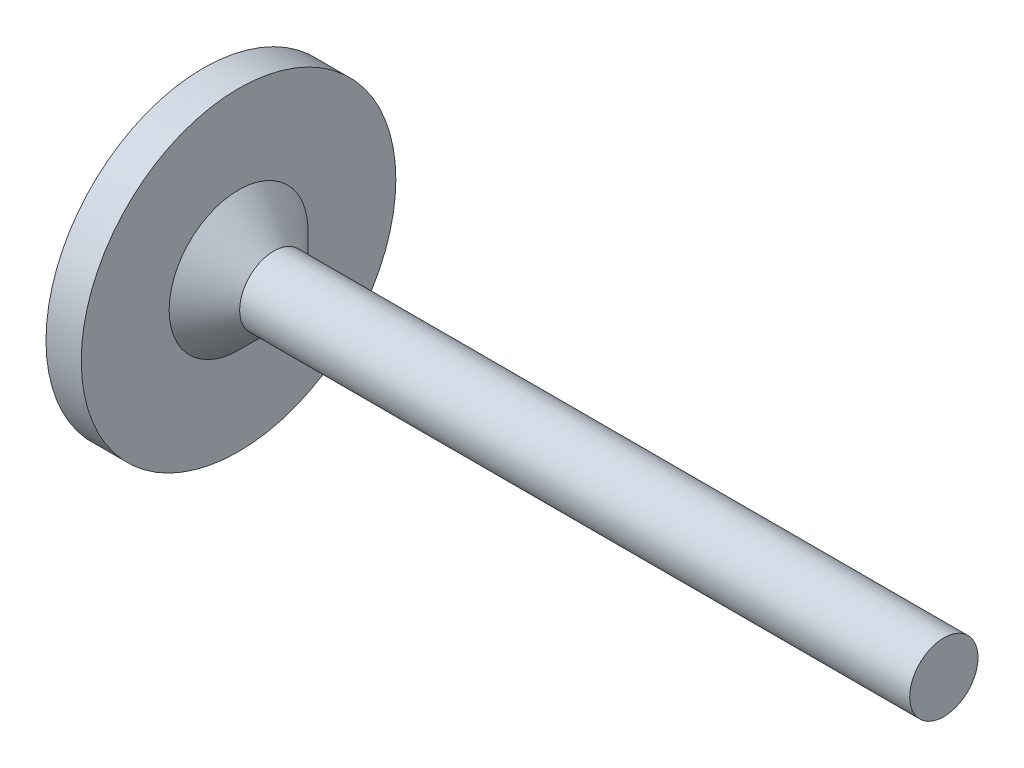
ISO-10303-21;
HEADER;
FILE_DESCRIPTION(('STEP AP214'),'2;1');
FILE_NAME('part.step','',(''),(''),'','','');
FILE_SCHEMA(('AUTOMOTIVE_DESIGN { 1 0 10303 214 1 1 1 1 }'));
ENDSEC;
DATA;
#1=APPLICATION_CONTEXT('core data for automotive mechanical design processes');
#2=APPLICATION_PROTOCOL_DEFINITION('international standard','automotive_design',2000,#1);
#3=PRODUCT_CONTEXT('',#1,'mechanical');
#4=PRODUCT('Part','Part','',(#3));
#5=PRODUCT_RELATED_PRODUCT_CATEGORY('part','',(#4));
#6=PRODUCT_DEFINITION_FORMATION('','',#4);
#7=PRODUCT_DEFINITION_CONTEXT('part definition',#1,'design');
#8=PRODUCT_DEFINITION('design','',#6,#7);
#9=PRODUCT_DEFINITION_SHAPE('','',#8);
#10=(LENGTH_UNIT() NAMED_UNIT(*) SI_UNIT(.MILLI.,.METRE.));
#11=(NAMED_UNIT(*) PLANE_ANGLE_UNIT() SI_UNIT($,.RADIAN.));
#12=(NAMED_UNIT(*) SI_UNIT($,.STERADIAN.) SOLID_ANGLE_UNIT());
#13=UNCERTAINTY_MEASURE_WITH_UNIT(LENGTH_MEASURE(1.E-05),#10,'distance_accuracy_value','');
#14=(GEOMETRIC_REPRESENTATION_CONTEXT(3) GLOBAL_UNCERTAINTY_ASSIGNED_CONTEXT((#13)) GLOBAL_UNIT_ASSIGNED_CONTEXT((#10,
#11,#12)) REPRESENTATION_CONTEXT('',''));
#15=CARTESIAN_POINT('',(0.,0.,0.));
#16=DIRECTION('',(0.,0.,1.));
#17=DIRECTION('',(1.,0.,0.));
#18=AXIS2_PLACEMENT_3D('',#15,#16,#17);
#19=CARTESIAN_POINT('',(127.,0.,0.));
#20=DIRECTION('',(-1.,0.,0.));
#21=DIRECTION('',(0.,0.,1.));
#22=AXIS2_PLACEMENT_3D('',#19,#20,#21);
#23=CYLINDRICAL_SURFACE('',#22,6.15);
#24=CARTESIAN_POINT('',(6.35000000000001,0.,0.));
#25=DIRECTION('',(-1.,0.,0.));
#26=DIRECTION('',(0.,0.,1.));
#27=AXIS2_PLACEMENT_3D('',#24,#25,#26);
#28=CIRCLE('',#27,6.15);
#29=CARTESIAN_POINT('',(6.35000000000001,0.,6.15));
#30=VERTEX_POINT('',#29);
#31=EDGE_CURVE('E45',#30,#30,#28,.F.);
#32=ORIENTED_EDGE('',*,*,#31,.T.);
#33=EDGE_LOOP('',(#32));
#34=FACE_BOUND('',#33,.T.);
#35=CARTESIAN_POINT('',(127.,0.,0.));
#36=DIRECTION('',(1.,0.,0.));
#37=DIRECTION('',(0.,0.,-1.));
#38=AXIS2_PLACEMENT_3D('',#35,#36,#37);
#39=CIRCLE('',#38,6.15);
#40=CARTESIAN_POINT('',(127.,0.,-6.15));
#41=VERTEX_POINT('',#40);
#42=EDGE_CURVE('E49',#41,#41,#39,.T.);
#43=ORIENTED_EDGE('',*,*,#42,.F.);
#44=EDGE_LOOP('',(#43));
#45=FACE_BOUND('',#44,.T.);
#46=ADVANCED_FACE('F37',(#34,#45),#23,.T.);
#47=CARTESIAN_POINT('',(127.,0.,0.));
#48=DIRECTION('',(1.,0.,0.));
#49=DIRECTION('',(0.,0.,-1.));
#50=AXIS2_PLACEMENT_3D('',#47,#48,#49);
#51=PLANE('',#50);
#52=ORIENTED_EDGE('',*,*,#42,.T.);
#53=EDGE_LOOP('',(#52));
#54=FACE_BOUND('',#53,.T.);
#55=ADVANCED_FACE('F67',(#54),#51,.T.);
#56=CARTESIAN_POINT('',(-6.35,0.,0.));
#57=DIRECTION('',(1.,0.,0.));
#58=DIRECTION('',(0.,0.,-1.));
#59=AXIS2_PLACEMENT_3D('',#56,#57,#58);
#60=CYLINDRICAL_SURFACE('',#59,28.321);
#61=CARTESIAN_POINT('',(-6.35,0.,0.));
#62=DIRECTION('',(-1.,0.,0.));
#63=DIRECTION('',(0.,0.,1.));
#64=AXIS2_PLACEMENT_3D('',#61,#62,#63);
#65=CIRCLE('',#64,28.321);
#66=CARTESIAN_POINT('',(-6.35,0.,28.321));
#67=VERTEX_POINT('',#66);
#68=EDGE_CURVE('E53',#67,#67,#65,.T.);
#69=ORIENTED_EDGE('',*,*,#68,.F.);
#70=EDGE_LOOP('',(#69));
#71=FACE_BOUND('',#70,.T.);
#72=CARTESIAN_POINT('',(0.,0.,0.));
#73=DIRECTION('',(-1.,0.,0.));
#74=DIRECTION('',(0.,0.,1.));
#75=AXIS2_PLACEMENT_3D('',#72,#73,#74);
#76=CIRCLE('',#75,28.321);
#77=CARTESIAN_POINT('',(0.,0.,28.321));
#78=VERTEX_POINT('',#77);
#79=EDGE_CURVE('E56',#78,#78,#76,.T.);
#80=ORIENTED_EDGE('',*,*,#79,.T.);
#81=EDGE_LOOP('',(#80));
#82=FACE_BOUND('',#81,.T.);
#83=ADVANCED_FACE('F64',(#71,#82),#60,.T.);
#84=CARTESIAN_POINT('',(-6.35,0.,0.));
#85=DIRECTION('',(-1.,0.,0.));
#86=DIRECTION('',(0.,0.,1.));
#87=AXIS2_PLACEMENT_3D('',#84,#85,#86);
#88=PLANE('',#87);
#89=ORIENTED_EDGE('',*,*,#68,.T.);
#90=EDGE_LOOP('',(#89));
#91=FACE_BOUND('',#90,.T.);
#92=ADVANCED_FACE('F62',(#91),#88,.T.);
#93=CARTESIAN_POINT('',(0.,0.,0.));
#94=DIRECTION('',(-1.,0.,0.));
#95=DIRECTION('',(0.,0.,1.));
#96=AXIS2_PLACEMENT_3D('',#93,#94,#95);
#97=PLANE('',#96);
#98=CARTESIAN_POINT('',(0.,0.,0.));
#99=DIRECTION('',(-1.,0.,0.));
#100=DIRECTION('',(0.,0.,1.));
#101=AXIS2_PLACEMENT_3D('',#98,#99,#100);
#102=CIRCLE('',#101,12.4999999999999);
#103=CARTESIAN_POINT('',(0.,0.,12.4999999999999));
#104=VERTEX_POINT('',#103);
#105=EDGE_CURVE('E10',#104,#104,#102,.T.);
#106=ORIENTED_EDGE('',*,*,#105,.T.);
#107=EDGE_LOOP('',(#106));
#108=FACE_BOUND('',#107,.T.);
#109=ORIENTED_EDGE('',*,*,#79,.F.);
#110=EDGE_LOOP('',(#109));
#111=FACE_BOUND('',#110,.T.);
#112=ADVANCED_FACE('F71',(#108,#111),#97,.F.);
#113=CARTESIAN_POINT('',(6.35000000000001,0.,0.));
#114=DIRECTION('',(-1.,0.,0.));
#115=DIRECTION('',(0.,0.,1.));
#116=AXIS2_PLACEMENT_3D('',#113,#114,#115);
#117=CONICAL_SURFACE('',#116,6.15,0.785398163397443);
#118=CARTESIAN_POINT('',(0.,0.,12.4999999999999));
#119=CARTESIAN_POINT('',(0.0661458333333346,0.,12.4338541666666));
#120=CARTESIAN_POINT('',(0.132291666666668,0.,12.3677083333333));
#121=CARTESIAN_POINT('',(0.264583333333335,0.,12.2354166666666));
#122=CARTESIAN_POINT('',(0.330729166666668,0.,12.1692708333333));
#123=CARTESIAN_POINT('',(0.463020833333335,0.,12.0369791666666));
#124=CARTESIAN_POINT('',(0.529166666666668,0.,11.9708333333333));
#125=CARTESIAN_POINT('',(0.661458333333335,0.,11.8385416666666));
#126=CARTESIAN_POINT('',(0.727604166666668,0.,11.7723958333333));
#127=CARTESIAN_POINT('',(0.859895833333335,0.,11.6401041666666));
#128=CARTESIAN_POINT('',(0.926041666666669,0.,11.5739583333333));
#129=CARTESIAN_POINT('',(1.05833333333334,0.,11.4416666666666));
#130=CARTESIAN_POINT('',(1.12447916666667,0.,11.3755208333333));
#131=CARTESIAN_POINT('',(1.25677083333334,0.,11.2432291666666));
#132=CARTESIAN_POINT('',(1.32291666666667,0.,11.1770833333333));
#133=CARTESIAN_POINT('',(1.45520833333334,0.,11.0447916666666));
#134=CARTESIAN_POINT('',(1.52135416666667,0.,10.9786458333333));
#135=CARTESIAN_POINT('',(1.65364583333334,0.,10.8463541666666));
#136=CARTESIAN_POINT('',(1.71979166666667,0.,10.7802083333333));
#137=CARTESIAN_POINT('',(1.85208333333334,0.,10.6479166666666));
#138=CARTESIAN_POINT('',(1.91822916666667,0.,10.5817708333333));
#139=CARTESIAN_POINT('',(2.05052083333334,0.,10.4494791666666));
#140=CARTESIAN_POINT('',(2.11666666666667,0.,10.3833333333333));
#141=CARTESIAN_POINT('',(2.24895833333334,0.,10.2510416666666));
#142=CARTESIAN_POINT('',(2.31510416666667,0.,10.1848958333333));
#143=CARTESIAN_POINT('',(2.44739583333334,0.,10.0526041666666));
#144=CARTESIAN_POINT('',(2.51354166666667,0.,9.9864583333333));
#145=CARTESIAN_POINT('',(2.64583333333334,0.,9.85416666666663));
#146=CARTESIAN_POINT('',(2.71197916666667,0.,9.7880208333333));
#147=CARTESIAN_POINT('',(2.84427083333334,0.,9.65572916666663));
#148=CARTESIAN_POINT('',(2.91041666666667,0.,9.5895833333333));
#149=CARTESIAN_POINT('',(3.04270833333334,0.,9.45729166666663));
#150=CARTESIAN_POINT('',(3.10885416666667,0.,9.3911458333333));
#151=CARTESIAN_POINT('',(3.24114583333334,0.,9.25885416666664));
#152=CARTESIAN_POINT('',(3.30729166666667,0.,9.1927083333333));
#153=CARTESIAN_POINT('',(3.43958333333334,0.,9.06041666666664));
#154=CARTESIAN_POINT('',(3.50572916666667,0.,8.9942708333333));
#155=CARTESIAN_POINT('',(3.63802083333334,0.,8.86197916666664));
#156=CARTESIAN_POINT('',(3.70416666666667,0.,8.79583333333331));
#157=CARTESIAN_POINT('',(3.83645833333334,0.,8.66354166666664));
#158=CARTESIAN_POINT('',(3.90260416666667,0.,8.59739583333331));
#159=CARTESIAN_POINT('',(4.03489583333334,0.,8.46510416666664));
#160=CARTESIAN_POINT('',(4.10104166666667,0.,8.39895833333331));
#161=CARTESIAN_POINT('',(4.23333333333334,0.,8.26666666666665));
#162=CARTESIAN_POINT('',(4.29947916666667,0.,8.20052083333331));
#163=CARTESIAN_POINT('',(4.43177083333334,0.,8.06822916666665));
#164=CARTESIAN_POINT('',(4.49791666666667,0.,8.00208333333332));
#165=CARTESIAN_POINT('',(4.63020833333334,0.,7.86979166666665));
#166=CARTESIAN_POINT('',(4.69635416666667,0.,7.80364583333332));
#167=CARTESIAN_POINT('',(4.82864583333334,0.,7.67135416666665));
#168=CARTESIAN_POINT('',(4.89479166666667,0.,7.60520833333332));
#169=CARTESIAN_POINT('',(5.02708333333334,0.,7.47291666666665));
#170=CARTESIAN_POINT('',(5.09322916666667,0.,7.40677083333332));
#171=CARTESIAN_POINT('',(5.22552083333334,0.,7.27447916666666));
#172=CARTESIAN_POINT('',(5.29166666666667,0.,7.20833333333332));
#173=CARTESIAN_POINT('',(5.42395833333334,0.,7.07604166666666));
#174=CARTESIAN_POINT('',(5.49010416666667,0.,7.00989583333332));
#175=CARTESIAN_POINT('',(5.62239583333334,0.,6.87760416666666));
#176=CARTESIAN_POINT('',(5.68854166666668,0.,6.81145833333333));
#177=CARTESIAN_POINT('',(5.82083333333334,0.,6.67916666666666));
#178=CARTESIAN_POINT('',(5.88697916666668,0.,6.61302083333333));
#179=CARTESIAN_POINT('',(6.01927083333334,0.,6.48072916666666));
#180=CARTESIAN_POINT('',(6.08541666666668,0.,6.41458333333333));
#181=CARTESIAN_POINT('',(6.21770833333334,0.,6.28229166666666));
#182=CARTESIAN_POINT('',(6.28385416666668,0.,6.21614583333333));
#183=CARTESIAN_POINT('',(6.35000000000001,0.,6.15));
#184=B_SPLINE_CURVE_WITH_KNOTS('',3,(#118,#119,#120,#121,#122,#123,#124,#125,#126,#127,#128,
#129,#130,#131,#132,#133,#134,#135,#136,#137,#138,#139,#140,#141,#142,#143,#144,#145,#146,#147,
#148,#149,#150,#151,#152,#153,#154,#155,#156,#157,#158,#159,#160,#161,#162,#163,#164,#165,#166,
#167,#168,#169,#170,#171,#172,#173,#174,#175,#176,#177,#178,#179,#180,#181,#182,#183),
.UNSPECIFIED.,.F.,.F.,(4,2,2,2,2,2,2,2,2,2,2,2,2,2,2,2,2,2,2,2,2,2,2,2,2,2,2,2,2,2,2,2,4),(0.,
0.280633003783411,0.561266007566821,0.841899011350232,1.12253201513364,1.40316501891705,
1.68379802270046,1.96443102648387,2.24506403026728,2.52569703405069,2.8063300378341,
3.08696304161751,3.36759604540092,3.64822904918433,3.92886205296774,4.20949505675115,
4.49012806053456,4.77076106431797,5.05139406810138,5.33202707188479,5.6126600756682,
5.89329307945161,6.17392608323502,6.45455908701843,6.73519209080184,7.01582509458525,
7.29645809836866,7.57709110215207,7.85772410593548,8.13835710971889,8.4189901135023,
8.69962311728571,8.98025612106912),.UNSPECIFIED.);
#185=EDGE_CURVE('BSEAM40',#104,#30,#184,.T.);
#186=ORIENTED_EDGE('',*,*,#105,.F.);
#187=ORIENTED_EDGE('',*,*,#31,.F.);
#188=ORIENTED_EDGE('',*,*,#185,.T.);
#189=ORIENTED_EDGE('',*,*,#185,.F.);
#190=EDGE_LOOP('',(#186,#188,#187,#189));
#191=FACE_BOUND('',#190,.T.);
#192=ADVANCED_FACE('F40',(#191),#117,.T.);
#193=CLOSED_SHELL('',(#46,#55,#83,#92,#112,#192));
#194=MANIFOLD_SOLID_BREP('B2',#193);
#195=ADVANCED_BREP_SHAPE_REPRESENTATION('',(#18,#194),#14);
#196=SHAPE_DEFINITION_REPRESENTATION(#9,#195);
ENDSEC;
END-ISO-10303-21;
